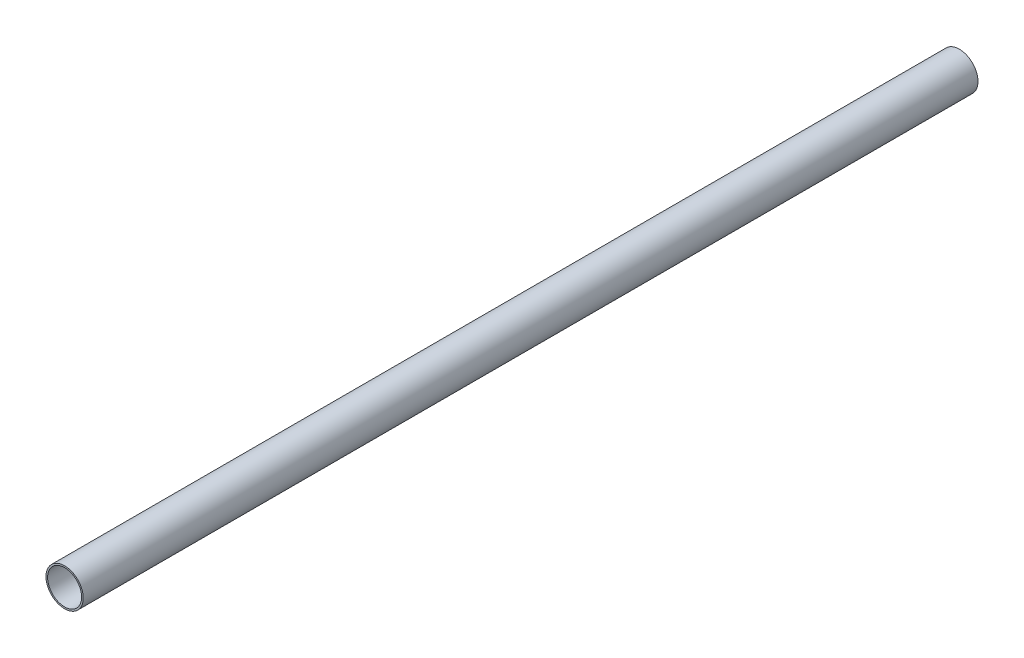
ISO-10303-21;
HEADER;
FILE_DESCRIPTION(('STEP AP214'),'2;1');
FILE_NAME('part.step','',(''),(''),'','','');
FILE_SCHEMA(('AUTOMOTIVE_DESIGN { 1 0 10303 214 1 1 1 1 }'));
ENDSEC;
DATA;
#1=APPLICATION_CONTEXT('core data for automotive mechanical design processes');
#2=APPLICATION_PROTOCOL_DEFINITION('international standard','automotive_design',2000,#1);
#3=PRODUCT_CONTEXT('',#1,'mechanical');
#4=PRODUCT('Part','Part','',(#3));
#5=PRODUCT_RELATED_PRODUCT_CATEGORY('part','',(#4));
#6=PRODUCT_DEFINITION_FORMATION('','',#4);
#7=PRODUCT_DEFINITION_CONTEXT('part definition',#1,'design');
#8=PRODUCT_DEFINITION('design','',#6,#7);
#9=PRODUCT_DEFINITION_SHAPE('','',#8);
#10=(LENGTH_UNIT() NAMED_UNIT(*) SI_UNIT(.MILLI.,.METRE.));
#11=(NAMED_UNIT(*) PLANE_ANGLE_UNIT() SI_UNIT($,.RADIAN.));
#12=(NAMED_UNIT(*) SI_UNIT($,.STERADIAN.) SOLID_ANGLE_UNIT());
#13=UNCERTAINTY_MEASURE_WITH_UNIT(LENGTH_MEASURE(1.E-05),#10,'distance_accuracy_value','');
#14=(GEOMETRIC_REPRESENTATION_CONTEXT(3) GLOBAL_UNCERTAINTY_ASSIGNED_CONTEXT((#13)) GLOBAL_UNIT_ASSIGNED_CONTEXT((#10,
#11,#12)) REPRESENTATION_CONTEXT('',''));
#15=CARTESIAN_POINT('',(0.,0.,0.));
#16=DIRECTION('',(0.,0.,1.));
#17=DIRECTION('',(1.,0.,0.));
#18=AXIS2_PLACEMENT_3D('',#15,#16,#17);
#19=CARTESIAN_POINT('',(0.,0.,457.2));
#20=DIRECTION('',(0.,0.,1.));
#21=DIRECTION('',(1.,0.,0.));
#22=AXIS2_PLACEMENT_3D('',#19,#20,#21);
#23=PLANE('',#22);
#24=CARTESIAN_POINT('',(0.,0.,457.2));
#25=DIRECTION('',(0.,0.,1.));
#26=DIRECTION('',(1.,0.,0.));
#27=AXIS2_PLACEMENT_3D('',#24,#25,#26);
#28=CIRCLE('',#27,19.05);
#29=CARTESIAN_POINT('',(19.05,0.,457.2));
#30=VERTEX_POINT('',#29);
#31=EDGE_CURVE('E10',#30,#30,#28,.T.);
#32=ORIENTED_EDGE('',*,*,#31,.T.);
#33=EDGE_LOOP('',(#32));
#34=FACE_BOUND('',#33,.T.);
#35=CARTESIAN_POINT('',(0.,0.,457.2));
#36=DIRECTION('',(0.,0.,1.));
#37=DIRECTION('',(1.,0.,0.));
#38=AXIS2_PLACEMENT_3D('',#35,#36,#37);
#39=CIRCLE('',#38,17.399);
#40=CARTESIAN_POINT('',(17.399,0.,457.2));
#41=VERTEX_POINT('',#40);
#42=EDGE_CURVE('E41',#41,#41,#39,.T.);
#43=ORIENTED_EDGE('',*,*,#42,.F.);
#44=EDGE_LOOP('',(#43));
#45=FACE_BOUND('',#44,.T.);
#46=ADVANCED_FACE('F30',(#34,#45),#23,.T.);
#47=CARTESIAN_POINT('',(0.,0.,-457.2));
#48=DIRECTION('',(0.,0.,1.));
#49=DIRECTION('',(1.,0.,0.));
#50=AXIS2_PLACEMENT_3D('',#47,#48,#49);
#51=PLANE('',#50);
#52=CARTESIAN_POINT('',(0.,0.,-457.2));
#53=DIRECTION('',(0.,0.,1.));
#54=DIRECTION('',(1.,0.,0.));
#55=AXIS2_PLACEMENT_3D('',#52,#53,#54);
#56=CIRCLE('',#55,19.05);
#57=CARTESIAN_POINT('',(19.05,0.,-457.2));
#58=VERTEX_POINT('',#57);
#59=EDGE_CURVE('E34',#58,#58,#56,.T.);
#60=ORIENTED_EDGE('',*,*,#59,.F.);
#61=EDGE_LOOP('',(#60));
#62=FACE_BOUND('',#61,.T.);
#63=CARTESIAN_POINT('',(0.,0.,-457.2));
#64=DIRECTION('',(0.,0.,1.));
#65=DIRECTION('',(1.,0.,0.));
#66=AXIS2_PLACEMENT_3D('',#63,#64,#65);
#67=CIRCLE('',#66,17.399);
#68=CARTESIAN_POINT('',(17.399,0.,-457.2));
#69=VERTEX_POINT('',#68);
#70=EDGE_CURVE('E43',#69,#69,#67,.T.);
#71=ORIENTED_EDGE('',*,*,#70,.T.);
#72=EDGE_LOOP('',(#71));
#73=FACE_BOUND('',#72,.T.);
#74=ADVANCED_FACE('F53',(#62,#73),#51,.F.);
#75=CARTESIAN_POINT('',(0.,0.,457.2));
#76=DIRECTION('',(0.,0.,-1.));
#77=DIRECTION('',(-1.,0.,0.));
#78=AXIS2_PLACEMENT_3D('',#75,#76,#77);
#79=CYLINDRICAL_SURFACE('',#78,19.05);
#80=ORIENTED_EDGE('',*,*,#31,.F.);
#81=EDGE_LOOP('',(#80));
#82=FACE_BOUND('',#81,.T.);
#83=ORIENTED_EDGE('',*,*,#59,.T.);
#84=EDGE_LOOP('',(#83));
#85=FACE_BOUND('',#84,.T.);
#86=ADVANCED_FACE('F32',(#82,#85),#79,.T.);
#87=CARTESIAN_POINT('',(0.,0.,457.2));
#88=DIRECTION('',(0.,0.,-1.));
#89=DIRECTION('',(-1.,0.,0.));
#90=AXIS2_PLACEMENT_3D('',#87,#88,#89);
#91=CYLINDRICAL_SURFACE('',#90,17.399);
#92=ORIENTED_EDGE('',*,*,#42,.T.);
#93=EDGE_LOOP('',(#92));
#94=FACE_BOUND('',#93,.T.);
#95=ORIENTED_EDGE('',*,*,#70,.F.);
#96=EDGE_LOOP('',(#95));
#97=FACE_BOUND('',#96,.T.);
#98=ADVANCED_FACE('F49',(#94,#97),#91,.F.);
#99=CLOSED_SHELL('',(#46,#74,#86,#98));
#100=MANIFOLD_SOLID_BREP('B2',#99);
#101=ADVANCED_BREP_SHAPE_REPRESENTATION('',(#18,#100),#14);
#102=SHAPE_DEFINITION_REPRESENTATION(#9,#101);
ENDSEC;
END-ISO-10303-21;
